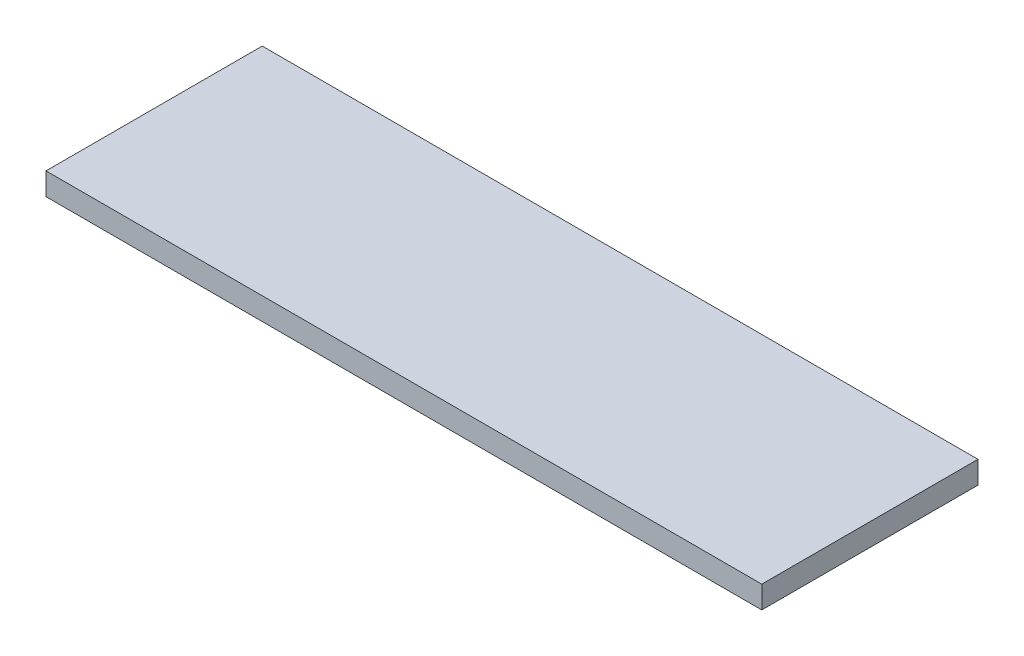
ISO-10303-21;
HEADER;
FILE_DESCRIPTION(('STEP AP214'),'2;1');
FILE_NAME('part.step','',(''),(''),'','','');
FILE_SCHEMA(('AUTOMOTIVE_DESIGN { 1 0 10303 214 1 1 1 1 }'));
ENDSEC;
DATA;
#1=APPLICATION_CONTEXT('core data for automotive mechanical design processes');
#2=APPLICATION_PROTOCOL_DEFINITION('international standard','automotive_design',2000,#1);
#3=PRODUCT_CONTEXT('',#1,'mechanical');
#4=PRODUCT('Part','Part','',(#3));
#5=PRODUCT_RELATED_PRODUCT_CATEGORY('part','',(#4));
#6=PRODUCT_DEFINITION_FORMATION('','',#4);
#7=PRODUCT_DEFINITION_CONTEXT('part definition',#1,'design');
#8=PRODUCT_DEFINITION('design','',#6,#7);
#9=PRODUCT_DEFINITION_SHAPE('','',#8);
#10=(LENGTH_UNIT() NAMED_UNIT(*) SI_UNIT(.MILLI.,.METRE.));
#11=(NAMED_UNIT(*) PLANE_ANGLE_UNIT() SI_UNIT($,.RADIAN.));
#12=(NAMED_UNIT(*) SI_UNIT($,.STERADIAN.) SOLID_ANGLE_UNIT());
#13=UNCERTAINTY_MEASURE_WITH_UNIT(LENGTH_MEASURE(1.E-05),#10,'distance_accuracy_value','');
#14=(GEOMETRIC_REPRESENTATION_CONTEXT(3) GLOBAL_UNCERTAINTY_ASSIGNED_CONTEXT((#13)) GLOBAL_UNIT_ASSIGNED_CONTEXT((#10,
#11,#12)) REPRESENTATION_CONTEXT('',''));
#15=CARTESIAN_POINT('',(0.,0.,0.));
#16=DIRECTION('',(0.,0.,1.));
#17=DIRECTION('',(1.,0.,0.));
#18=AXIS2_PLACEMENT_3D('',#15,#16,#17);
#19=CARTESIAN_POINT('',(304.8,19.05,-92.075));
#20=DIRECTION('',(-1.,0.,0.));
#21=DIRECTION('',(0.,0.,1.));
#22=AXIS2_PLACEMENT_3D('',#19,#20,#21);
#23=PLANE('',#22);
#24=DIRECTION('',(0.,0.,-1.));
#25=VECTOR('',#24,1.);
#26=CARTESIAN_POINT('',(304.8,0.,-92.075));
#27=LINE('',#26,#25);
#28=CARTESIAN_POINT('',(304.8,0.,92.075));
#29=VERTEX_POINT('',#28);
#30=CARTESIAN_POINT('',(304.8,0.,-92.075));
#31=VERTEX_POINT('',#30);
#32=EDGE_CURVE('E103',#29,#31,#27,.T.);
#33=ORIENTED_EDGE('',*,*,#32,.T.);
#34=DIRECTION('',(0.,-1.,0.));
#35=VECTOR('',#34,1.);
#36=CARTESIAN_POINT('',(304.8,19.05,-92.075));
#37=LINE('',#36,#35);
#38=CARTESIAN_POINT('',(304.8,19.05,-92.075));
#39=VERTEX_POINT('',#38);
#40=EDGE_CURVE('E11',#39,#31,#37,.T.);
#41=ORIENTED_EDGE('',*,*,#40,.F.);
#42=DIRECTION('',(0.,0.,-1.));
#43=VECTOR('',#42,1.);
#44=CARTESIAN_POINT('',(304.8,19.05,-92.075));
#45=LINE('',#44,#43);
#46=CARTESIAN_POINT('',(304.8,19.05,92.075));
#47=VERTEX_POINT('',#46);
#48=EDGE_CURVE('E90',#47,#39,#45,.T.);
#49=ORIENTED_EDGE('',*,*,#48,.F.);
#50=DIRECTION('',(0.,-1.,0.));
#51=VECTOR('',#50,1.);
#52=CARTESIAN_POINT('',(304.8,19.05,92.075));
#53=LINE('',#52,#51);
#54=EDGE_CURVE('E99',#47,#29,#53,.T.);
#55=ORIENTED_EDGE('',*,*,#54,.T.);
#56=EDGE_LOOP('',(#33,#41,#49,#55));
#57=FACE_BOUND('',#56,.T.);
#58=ADVANCED_FACE('F39',(#57),#23,.F.);
#59=CARTESIAN_POINT('',(-304.8,19.05,-92.075));
#60=DIRECTION('',(0.,0.,1.));
#61=DIRECTION('',(1.,0.,0.));
#62=AXIS2_PLACEMENT_3D('',#59,#60,#61);
#63=PLANE('',#62);
#64=DIRECTION('',(-1.,0.,0.));
#65=VECTOR('',#64,1.);
#66=CARTESIAN_POINT('',(-304.8,0.,-92.075));
#67=LINE('',#66,#65);
#68=CARTESIAN_POINT('',(-304.8,0.,-92.075));
#69=VERTEX_POINT('',#68);
#70=EDGE_CURVE('E95',#31,#69,#67,.T.);
#71=ORIENTED_EDGE('',*,*,#70,.T.);
#72=DIRECTION('',(0.,-1.,0.));
#73=VECTOR('',#72,1.);
#74=CARTESIAN_POINT('',(-304.8,19.05,-92.075));
#75=LINE('',#74,#73);
#76=CARTESIAN_POINT('',(-304.8,19.05,-92.075));
#77=VERTEX_POINT('',#76);
#78=EDGE_CURVE('E47',#77,#69,#75,.T.);
#79=ORIENTED_EDGE('',*,*,#78,.F.);
#80=DIRECTION('',(-1.,0.,0.));
#81=VECTOR('',#80,1.);
#82=CARTESIAN_POINT('',(-304.8,19.05,-92.075));
#83=LINE('',#82,#81);
#84=EDGE_CURVE('E85',#39,#77,#83,.T.);
#85=ORIENTED_EDGE('',*,*,#84,.F.);
#86=ORIENTED_EDGE('',*,*,#40,.T.);
#87=EDGE_LOOP('',(#71,#79,#85,#86));
#88=FACE_BOUND('',#87,.T.);
#89=ADVANCED_FACE('F94',(#88),#63,.F.);
#90=CARTESIAN_POINT('',(-304.8,19.05,-92.075));
#91=DIRECTION('',(1.,0.,0.));
#92=DIRECTION('',(0.,0.,-1.));
#93=AXIS2_PLACEMENT_3D('',#90,#91,#92);
#94=PLANE('',#93);
#95=DIRECTION('',(0.,0.,1.));
#96=VECTOR('',#95,1.);
#97=CARTESIAN_POINT('',(-304.8,0.,-92.075));
#98=LINE('',#97,#96);
#99=CARTESIAN_POINT('',(-304.8,0.,92.075));
#100=VERTEX_POINT('',#99);
#101=EDGE_CURVE('E72',#69,#100,#98,.T.);
#102=ORIENTED_EDGE('',*,*,#101,.T.);
#103=DIRECTION('',(0.,-1.,0.));
#104=VECTOR('',#103,1.);
#105=CARTESIAN_POINT('',(-304.8,19.05,92.075));
#106=LINE('',#105,#104);
#107=CARTESIAN_POINT('',(-304.8,19.05,92.075));
#108=VERTEX_POINT('',#107);
#109=EDGE_CURVE('E96',#108,#100,#106,.T.);
#110=ORIENTED_EDGE('',*,*,#109,.F.);
#111=DIRECTION('',(0.,0.,1.));
#112=VECTOR('',#111,1.);
#113=CARTESIAN_POINT('',(-304.8,19.05,-92.075));
#114=LINE('',#113,#112);
#115=EDGE_CURVE('E88',#77,#108,#114,.T.);
#116=ORIENTED_EDGE('',*,*,#115,.F.);
#117=ORIENTED_EDGE('',*,*,#78,.T.);
#118=EDGE_LOOP('',(#102,#110,#116,#117));
#119=FACE_BOUND('',#118,.T.);
#120=ADVANCED_FACE('F97',(#119),#94,.F.);
#121=CARTESIAN_POINT('',(-304.8,19.05,92.075));
#122=DIRECTION('',(0.,0.,-1.));
#123=DIRECTION('',(-1.,0.,0.));
#124=AXIS2_PLACEMENT_3D('',#121,#122,#123);
#125=PLANE('',#124);
#126=DIRECTION('',(1.,0.,0.));
#127=VECTOR('',#126,1.);
#128=CARTESIAN_POINT('',(-304.8,0.,92.075));
#129=LINE('',#128,#127);
#130=EDGE_CURVE('E78',#100,#29,#129,.T.);
#131=ORIENTED_EDGE('',*,*,#130,.T.);
#132=ORIENTED_EDGE('',*,*,#54,.F.);
#133=DIRECTION('',(1.,0.,0.));
#134=VECTOR('',#133,1.);
#135=CARTESIAN_POINT('',(-304.8,19.05,92.075));
#136=LINE('',#135,#134);
#137=EDGE_CURVE('E55',#108,#47,#136,.T.);
#138=ORIENTED_EDGE('',*,*,#137,.F.);
#139=ORIENTED_EDGE('',*,*,#109,.T.);
#140=EDGE_LOOP('',(#131,#132,#138,#139));
#141=FACE_BOUND('',#140,.T.);
#142=ADVANCED_FACE('F111',(#141),#125,.F.);
#143=CARTESIAN_POINT('',(0.,19.05,0.));
#144=DIRECTION('',(0.,1.,0.));
#145=DIRECTION('',(0.,0.,1.));
#146=AXIS2_PLACEMENT_3D('',#143,#144,#145);
#147=PLANE('',#146);
#148=ORIENTED_EDGE('',*,*,#48,.T.);
#149=ORIENTED_EDGE('',*,*,#84,.T.);
#150=ORIENTED_EDGE('',*,*,#115,.T.);
#151=ORIENTED_EDGE('',*,*,#137,.T.);
#152=EDGE_LOOP('',(#148,#149,#150,#151));
#153=FACE_BOUND('',#152,.T.);
#154=ADVANCED_FACE('F86',(#153),#147,.T.);
#155=CARTESIAN_POINT('',(0.,0.,0.));
#156=DIRECTION('',(0.,1.,0.));
#157=DIRECTION('',(0.,0.,1.));
#158=AXIS2_PLACEMENT_3D('',#155,#156,#157);
#159=PLANE('',#158);
#160=ORIENTED_EDGE('',*,*,#32,.F.);
#161=ORIENTED_EDGE('',*,*,#130,.F.);
#162=ORIENTED_EDGE('',*,*,#101,.F.);
#163=ORIENTED_EDGE('',*,*,#70,.F.);
#164=EDGE_LOOP('',(#160,#161,#162,#163));
#165=FACE_BOUND('',#164,.T.);
#166=ADVANCED_FACE('F114',(#165),#159,.F.);
#167=CLOSED_SHELL('',(#58,#89,#120,#142,#154,#166));
#168=MANIFOLD_SOLID_BREP('B2',#167);
#169=ADVANCED_BREP_SHAPE_REPRESENTATION('',(#18,#168),#14);
#170=SHAPE_DEFINITION_REPRESENTATION(#9,#169);
ENDSEC;
END-ISO-10303-21;
